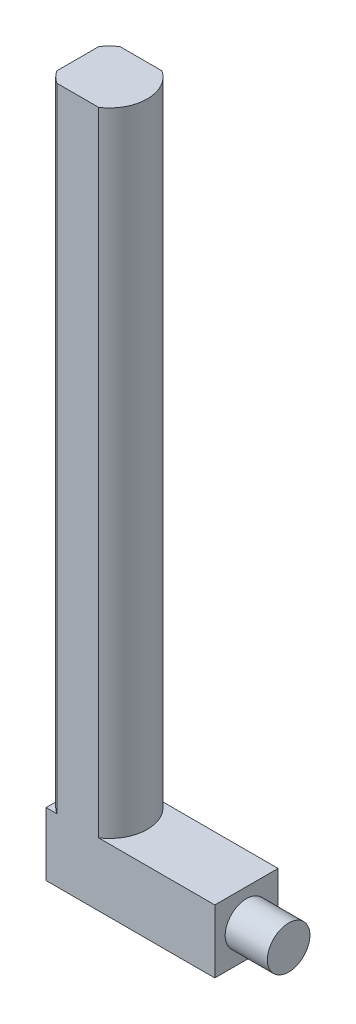
ISO-10303-21;
HEADER;
FILE_DESCRIPTION(('STEP AP214'),'2;1');
FILE_NAME('part.step','',(''),(''),'','','');
FILE_SCHEMA(('AUTOMOTIVE_DESIGN { 1 0 10303 214 1 1 1 1 }'));
ENDSEC;
DATA;
#1=APPLICATION_CONTEXT('core data for automotive mechanical design processes');
#2=APPLICATION_PROTOCOL_DEFINITION('international standard','automotive_design',2000,#1);
#3=PRODUCT_CONTEXT('',#1,'mechanical');
#4=PRODUCT('Part','Part','',(#3));
#5=PRODUCT_RELATED_PRODUCT_CATEGORY('part','',(#4));
#6=PRODUCT_DEFINITION_FORMATION('','',#4);
#7=PRODUCT_DEFINITION_CONTEXT('part definition',#1,'design');
#8=PRODUCT_DEFINITION('design','',#6,#7);
#9=PRODUCT_DEFINITION_SHAPE('','',#8);
#10=(LENGTH_UNIT() NAMED_UNIT(*) SI_UNIT(.MILLI.,.METRE.));
#11=(NAMED_UNIT(*) PLANE_ANGLE_UNIT() SI_UNIT($,.RADIAN.));
#12=(NAMED_UNIT(*) SI_UNIT($,.STERADIAN.) SOLID_ANGLE_UNIT());
#13=UNCERTAINTY_MEASURE_WITH_UNIT(LENGTH_MEASURE(1.E-05),#10,'distance_accuracy_value','');
#14=(GEOMETRIC_REPRESENTATION_CONTEXT(3) GLOBAL_UNCERTAINTY_ASSIGNED_CONTEXT((#13)) GLOBAL_UNIT_ASSIGNED_CONTEXT((#10,
#11,#12)) REPRESENTATION_CONTEXT('',''));
#15=CARTESIAN_POINT('',(0.,0.,0.));
#16=DIRECTION('',(0.,0.,1.));
#17=DIRECTION('',(1.,0.,0.));
#18=AXIS2_PLACEMENT_3D('',#15,#16,#17);
#19=CARTESIAN_POINT('',(-14.053094549401,-33.4957977879027,9.525));
#20=DIRECTION('',(0.,1.,0.));
#21=DIRECTION('',(0.,0.,1.));
#22=AXIS2_PLACEMENT_3D('',#19,#20,#21);
#23=PLANE('',#22);
#24=CARTESIAN_POINT('',(14.521905450599,-33.4957977879027,-19.05));
#25=DIRECTION('',(0.,1.,0.));
#26=DIRECTION('',(0.,0.,1.));
#27=AXIS2_PLACEMENT_3D('',#24,#25,#26);
#28=CIRCLE('',#27,34.283027690858);
#29=CARTESIAN_POINT('',(33.4637998292543,-33.4957977879027,9.525));
#30=VERTEX_POINT('',#29);
#31=CARTESIAN_POINT('',(33.4637998292543,-33.4957977879027,-47.625));
#32=VERTEX_POINT('',#31);
#33=EDGE_CURVE('E140',#30,#32,#28,.T.);
#34=ORIENTED_EDGE('',*,*,#33,.F.);
#35=DIRECTION('',(1.,0.,0.));
#36=VECTOR('',#35,1.);
#37=CARTESIAN_POINT('',(-14.053094549401,-33.4957977879027,9.525));
#38=LINE('',#37,#36);
#39=CARTESIAN_POINT('',(138.346905450599,-33.4957977879027,9.525));
#40=VERTEX_POINT('',#39);
#41=EDGE_CURVE('E152',#30,#40,#38,.T.);
#42=ORIENTED_EDGE('',*,*,#41,.T.);
#43=DIRECTION('',(0.,0.,-1.));
#44=VECTOR('',#43,1.);
#45=CARTESIAN_POINT('',(138.346905450599,-33.4957977879027,9.525));
#46=LINE('',#45,#44);
#47=CARTESIAN_POINT('',(138.346905450599,-33.4957977879027,-47.625));
#48=VERTEX_POINT('',#47);
#49=EDGE_CURVE('E156',#40,#48,#46,.T.);
#50=ORIENTED_EDGE('',*,*,#49,.T.);
#51=DIRECTION('',(-1.,0.,0.));
#52=VECTOR('',#51,1.);
#53=CARTESIAN_POINT('',(138.346905450599,-33.4957977879027,-47.625));
#54=LINE('',#53,#52);
#55=EDGE_CURVE('E64',#48,#32,#54,.T.);
#56=ORIENTED_EDGE('',*,*,#55,.T.);
#57=EDGE_LOOP('',(#34,#42,#50,#56));
#58=FACE_BOUND('',#57,.T.);
#59=ADVANCED_FACE('F40',(#58),#23,.T.);
#60=CARTESIAN_POINT('',(14.521905450599,-33.4957977879027,-19.05));
#61=DIRECTION('',(0.,1.,0.));
#62=DIRECTION('',(0.,0.,1.));
#63=AXIS2_PLACEMENT_3D('',#60,#61,#62);
#64=CIRCLE('',#63,34.283027690858);
#65=CARTESIAN_POINT('',(-14.053094549401,-33.4957977879027,-0.1081056213447));
#66=VERTEX_POINT('',#65);
#67=CARTESIAN_POINT('',(-4.41998892805627,-33.4957977879027,9.525));
#68=VERTEX_POINT('',#67);
#69=EDGE_CURVE('E137',#66,#68,#64,.T.);
#70=ORIENTED_EDGE('',*,*,#69,.F.);
#71=DIRECTION('',(0.,0.,1.));
#72=VECTOR('',#71,1.);
#73=CARTESIAN_POINT('',(-14.053094549401,-33.4957977879027,-47.625));
#74=LINE('',#73,#72);
#75=CARTESIAN_POINT('',(-14.053094549401,-33.4957977879027,9.525));
#76=VERTEX_POINT('',#75);
#77=EDGE_CURVE('E153',#66,#76,#74,.T.);
#78=ORIENTED_EDGE('',*,*,#77,.T.);
#79=EDGE_CURVE('E154',#76,#68,#38,.T.);
#80=ORIENTED_EDGE('',*,*,#79,.T.);
#81=EDGE_LOOP('',(#70,#78,#80));
#82=FACE_BOUND('',#81,.T.);
#83=ADVANCED_FACE('F221',(#82),#23,.T.);
#84=CARTESIAN_POINT('',(-14.053094549401,-33.4957977879027,-47.625));
#85=DIRECTION('',(1.,0.,0.));
#86=DIRECTION('',(0.,0.,-1.));
#87=AXIS2_PLACEMENT_3D('',#84,#85,#86);
#88=PLANE('',#87);
#89=DIRECTION('',(0.,0.,1.));
#90=VECTOR('',#89,1.);
#91=CARTESIAN_POINT('',(-14.053094549401,-90.6457977879027,-47.625));
#92=LINE('',#91,#90);
#93=CARTESIAN_POINT('',(-14.053094549401,-90.6457977879027,-47.625));
#94=VERTEX_POINT('',#93);
#95=CARTESIAN_POINT('',(-14.053094549401,-90.6457977879027,9.525));
#96=VERTEX_POINT('',#95);
#97=EDGE_CURVE('E144',#94,#96,#92,.T.);
#98=ORIENTED_EDGE('',*,*,#97,.T.);
#99=DIRECTION('',(0.,-1.,0.));
#100=VECTOR('',#99,1.);
#101=CARTESIAN_POINT('',(-14.053094549401,-33.4957977879027,9.525));
#102=LINE('',#101,#100);
#103=EDGE_CURVE('E44',#76,#96,#102,.T.);
#104=ORIENTED_EDGE('',*,*,#103,.F.);
#105=ORIENTED_EDGE('',*,*,#77,.F.);
#106=DIRECTION('',(0.,-1.,0.));
#107=VECTOR('',#106,1.);
#108=CARTESIAN_POINT('',(-14.053094549401,538.004202212097,-0.1081056213447));
#109=LINE('',#108,#107);
#110=CARTESIAN_POINT('',(-14.053094549401,538.004202212097,-0.1081056213447));
#111=VERTEX_POINT('',#110);
#112=EDGE_CURVE('E211',#111,#66,#109,.T.);
#113=ORIENTED_EDGE('',*,*,#112,.F.);
#114=DIRECTION('',(0.,0.,1.));
#115=VECTOR('',#114,1.);
#116=CARTESIAN_POINT('',(-14.053094549401,538.004202212097,9.525));
#117=LINE('',#116,#115);
#118=CARTESIAN_POINT('',(-14.053094549401,538.004202212097,-37.9918943786553));
#119=VERTEX_POINT('',#118);
#120=EDGE_CURVE('E219',#119,#111,#117,.T.);
#121=ORIENTED_EDGE('',*,*,#120,.F.);
#122=DIRECTION('',(0.,-1.,0.));
#123=VECTOR('',#122,1.);
#124=CARTESIAN_POINT('',(-14.053094549401,538.004202212097,-37.9918943786553));
#125=LINE('',#124,#123);
#126=CARTESIAN_POINT('',(-14.053094549401,-33.4957977879027,-37.9918943786553));
#127=VERTEX_POINT('',#126);
#128=EDGE_CURVE('E146',#119,#127,#125,.T.);
#129=ORIENTED_EDGE('',*,*,#128,.T.);
#130=CARTESIAN_POINT('',(-14.053094549401,-33.4957977879027,-47.625));
#131=VERTEX_POINT('',#130);
#132=EDGE_CURVE('E150',#131,#127,#74,.T.);
#133=ORIENTED_EDGE('',*,*,#132,.F.);
#134=DIRECTION('',(0.,-1.,0.));
#135=VECTOR('',#134,1.);
#136=CARTESIAN_POINT('',(-14.053094549401,-33.4957977879027,-47.625));
#137=LINE('',#136,#135);
#138=EDGE_CURVE('E160',#131,#94,#137,.T.);
#139=ORIENTED_EDGE('',*,*,#138,.T.);
#140=EDGE_LOOP('',(#98,#104,#105,#113,#121,#129,#133,#139));
#141=FACE_BOUND('',#140,.T.);
#142=ADVANCED_FACE('F42',(#141),#88,.F.);
#143=CARTESIAN_POINT('',(-14.053094549401,-33.4957977879027,9.525));
#144=DIRECTION('',(0.,0.,-1.));
#145=DIRECTION('',(-1.,0.,0.));
#146=AXIS2_PLACEMENT_3D('',#143,#144,#145);
#147=PLANE('',#146);
#148=DIRECTION('',(1.,0.,0.));
#149=VECTOR('',#148,1.);
#150=CARTESIAN_POINT('',(-14.053094549401,-90.6457977879027,9.525));
#151=LINE('',#150,#149);
#152=CARTESIAN_POINT('',(138.346905450599,-90.6457977879027,9.525));
#153=VERTEX_POINT('',#152);
#154=EDGE_CURVE('E163',#96,#153,#151,.T.);
#155=ORIENTED_EDGE('',*,*,#154,.T.);
#156=DIRECTION('',(0.,-1.,0.));
#157=VECTOR('',#156,1.);
#158=CARTESIAN_POINT('',(138.346905450599,-33.4957977879027,9.525));
#159=LINE('',#158,#157);
#160=EDGE_CURVE('E173',#40,#153,#159,.T.);
#161=ORIENTED_EDGE('',*,*,#160,.F.);
#162=ORIENTED_EDGE('',*,*,#41,.F.);
#163=DIRECTION('',(0.,-1.,0.));
#164=VECTOR('',#163,1.);
#165=CARTESIAN_POINT('',(33.4637998292543,538.004202212097,9.525));
#166=LINE('',#165,#164);
#167=CARTESIAN_POINT('',(33.4637998292543,538.004202212097,9.525));
#168=VERTEX_POINT('',#167);
#169=EDGE_CURVE('E207',#168,#30,#166,.T.);
#170=ORIENTED_EDGE('',*,*,#169,.F.);
#171=DIRECTION('',(1.,0.,0.));
#172=VECTOR('',#171,1.);
#173=CARTESIAN_POINT('',(-14.053094549401,538.004202212097,9.525));
#174=LINE('',#173,#172);
#175=CARTESIAN_POINT('',(-4.41998892805627,538.004202212097,9.525));
#176=VERTEX_POINT('',#175);
#177=EDGE_CURVE('E133',#176,#168,#174,.T.);
#178=ORIENTED_EDGE('',*,*,#177,.F.);
#179=DIRECTION('',(0.,-1.,0.));
#180=VECTOR('',#179,1.);
#181=CARTESIAN_POINT('',(-4.41998892805627,538.004202212097,9.525));
#182=LINE('',#181,#180);
#183=EDGE_CURVE('E209',#176,#68,#182,.T.);
#184=ORIENTED_EDGE('',*,*,#183,.T.);
#185=ORIENTED_EDGE('',*,*,#79,.F.);
#186=ORIENTED_EDGE('',*,*,#103,.T.);
#187=EDGE_LOOP('',(#155,#161,#162,#170,#178,#184,#185,#186));
#188=FACE_BOUND('',#187,.T.);
#189=ADVANCED_FACE('F183',(#188),#147,.F.);
#190=CARTESIAN_POINT('',(138.346905450599,-33.4957977879027,9.525));
#191=DIRECTION('',(-1.,0.,0.));
#192=DIRECTION('',(0.,0.,1.));
#193=AXIS2_PLACEMENT_3D('',#190,#191,#192);
#194=PLANE('',#193);
#195=CARTESIAN_POINT('',(138.346905450599,-62.0707977879027,-19.05));
#196=DIRECTION('',(1.,0.,0.));
#197=DIRECTION('',(0.,0.,-1.));
#198=AXIS2_PLACEMENT_3D('',#195,#196,#197);
#199=CIRCLE('',#198,19.216165489231);
#200=CARTESIAN_POINT('',(138.346905450599,-62.0707977879027,-38.266165489231));
#201=VERTEX_POINT('',#200);
#202=EDGE_CURVE('E11',#201,#201,#199,.T.);
#203=ORIENTED_EDGE('',*,*,#202,.F.);
#204=EDGE_LOOP('',(#203));
#205=FACE_BOUND('',#204,.T.);
#206=DIRECTION('',(0.,0.,-1.));
#207=VECTOR('',#206,1.);
#208=CARTESIAN_POINT('',(138.346905450599,-90.6457977879027,9.525));
#209=LINE('',#208,#207);
#210=CARTESIAN_POINT('',(138.346905450599,-90.6457977879027,-47.625));
#211=VERTEX_POINT('',#210);
#212=EDGE_CURVE('E165',#153,#211,#209,.T.);
#213=ORIENTED_EDGE('',*,*,#212,.T.);
#214=DIRECTION('',(0.,-1.,0.));
#215=VECTOR('',#214,1.);
#216=CARTESIAN_POINT('',(138.346905450599,-33.4957977879027,-47.625));
#217=LINE('',#216,#215);
#218=EDGE_CURVE('E171',#48,#211,#217,.T.);
#219=ORIENTED_EDGE('',*,*,#218,.F.);
#220=ORIENTED_EDGE('',*,*,#49,.F.);
#221=ORIENTED_EDGE('',*,*,#160,.T.);
#222=EDGE_LOOP('',(#213,#219,#220,#221));
#223=FACE_BOUND('',#222,.T.);
#224=ADVANCED_FACE('F194',(#205,#223),#194,.F.);
#225=CARTESIAN_POINT('',(138.346905450599,-33.4957977879027,-47.625));
#226=DIRECTION('',(0.,0.,1.));
#227=DIRECTION('',(1.,0.,0.));
#228=AXIS2_PLACEMENT_3D('',#225,#226,#227);
#229=PLANE('',#228);
#230=DIRECTION('',(-1.,0.,0.));
#231=VECTOR('',#230,1.);
#232=CARTESIAN_POINT('',(138.346905450599,-90.6457977879027,-47.625));
#233=LINE('',#232,#231);
#234=EDGE_CURVE('E167',#211,#94,#233,.T.);
#235=ORIENTED_EDGE('',*,*,#234,.T.);
#236=ORIENTED_EDGE('',*,*,#138,.F.);
#237=CARTESIAN_POINT('',(-4.41998892805627,-33.4957977879027,-47.625));
#238=VERTEX_POINT('',#237);
#239=EDGE_CURVE('E158',#238,#131,#54,.T.);
#240=ORIENTED_EDGE('',*,*,#239,.F.);
#241=DIRECTION('',(0.,-1.,0.));
#242=VECTOR('',#241,1.);
#243=CARTESIAN_POINT('',(-4.41998892805627,538.004202212097,-47.625));
#244=LINE('',#243,#242);
#245=CARTESIAN_POINT('',(-4.41998892805627,538.004202212097,-47.625));
#246=VERTEX_POINT('',#245);
#247=EDGE_CURVE('E124',#246,#238,#244,.T.);
#248=ORIENTED_EDGE('',*,*,#247,.F.);
#249=DIRECTION('',(-1.,0.,0.));
#250=VECTOR('',#249,1.);
#251=CARTESIAN_POINT('',(-14.053094549401,538.004202212097,-47.625));
#252=LINE('',#251,#250);
#253=CARTESIAN_POINT('',(33.4637998292543,538.004202212097,-47.625));
#254=VERTEX_POINT('',#253);
#255=EDGE_CURVE('E117',#254,#246,#252,.T.);
#256=ORIENTED_EDGE('',*,*,#255,.F.);
#257=DIRECTION('',(0.,-1.,0.));
#258=VECTOR('',#257,1.);
#259=CARTESIAN_POINT('',(33.4637998292543,538.004202212097,-47.625));
#260=LINE('',#259,#258);
#261=EDGE_CURVE('E121',#254,#32,#260,.T.);
#262=ORIENTED_EDGE('',*,*,#261,.T.);
#263=ORIENTED_EDGE('',*,*,#55,.F.);
#264=ORIENTED_EDGE('',*,*,#218,.T.);
#265=EDGE_LOOP('',(#235,#236,#240,#248,#256,#262,#263,#264));
#266=FACE_BOUND('',#265,.T.);
#267=ADVANCED_FACE('F119',(#266),#229,.F.);
#268=CARTESIAN_POINT('',(14.521905450599,-33.4957977879027,-19.05));
#269=DIRECTION('',(0.,1.,0.));
#270=DIRECTION('',(0.,0.,1.));
#271=AXIS2_PLACEMENT_3D('',#268,#269,#270);
#272=CIRCLE('',#271,34.283027690858);
#273=EDGE_CURVE('E56',#238,#127,#272,.T.);
#274=ORIENTED_EDGE('',*,*,#273,.F.);
#275=ORIENTED_EDGE('',*,*,#239,.T.);
#276=ORIENTED_EDGE('',*,*,#132,.T.);
#277=EDGE_LOOP('',(#274,#275,#276));
#278=FACE_BOUND('',#277,.T.);
#279=ADVANCED_FACE('F198',(#278),#23,.T.);
#280=CARTESIAN_POINT('',(-14.053094549401,-90.6457977879027,9.525));
#281=DIRECTION('',(0.,1.,0.));
#282=DIRECTION('',(0.,0.,1.));
#283=AXIS2_PLACEMENT_3D('',#280,#281,#282);
#284=PLANE('',#283);
#285=ORIENTED_EDGE('',*,*,#97,.F.);
#286=ORIENTED_EDGE('',*,*,#234,.F.);
#287=ORIENTED_EDGE('',*,*,#212,.F.);
#288=ORIENTED_EDGE('',*,*,#154,.F.);
#289=EDGE_LOOP('',(#285,#286,#287,#288));
#290=FACE_BOUND('',#289,.T.);
#291=ADVANCED_FACE('F192',(#290),#284,.F.);
#292=CARTESIAN_POINT('',(176.446905450599,-62.0707977879027,-19.05));
#293=DIRECTION('',(-1.,0.,0.));
#294=DIRECTION('',(0.,0.,1.));
#295=AXIS2_PLACEMENT_3D('',#292,#293,#294);
#296=CYLINDRICAL_SURFACE('',#295,19.216165489231);
#297=CARTESIAN_POINT('',(176.446905450599,-62.0707977879027,-19.05));
#298=DIRECTION('',(1.,0.,0.));
#299=DIRECTION('',(0.,0.,-1.));
#300=AXIS2_PLACEMENT_3D('',#297,#298,#299);
#301=CIRCLE('',#300,19.216165489231);
#302=CARTESIAN_POINT('',(176.446905450599,-62.0707977879027,-38.266165489231));
#303=VERTEX_POINT('',#302);
#304=EDGE_CURVE('E141',#303,#303,#301,.T.);
#305=ORIENTED_EDGE('',*,*,#304,.F.);
#306=EDGE_LOOP('',(#305));
#307=FACE_BOUND('',#306,.T.);
#308=ORIENTED_EDGE('',*,*,#202,.T.);
#309=EDGE_LOOP('',(#308));
#310=FACE_BOUND('',#309,.T.);
#311=ADVANCED_FACE('F235',(#307,#310),#296,.T.);
#312=CARTESIAN_POINT('',(176.446905450599,-90.6457977879027,9.525));
#313=DIRECTION('',(1.,0.,0.));
#314=DIRECTION('',(0.,0.,-1.));
#315=AXIS2_PLACEMENT_3D('',#312,#313,#314);
#316=PLANE('',#315);
#317=ORIENTED_EDGE('',*,*,#304,.T.);
#318=EDGE_LOOP('',(#317));
#319=FACE_BOUND('',#318,.T.);
#320=ADVANCED_FACE('F280',(#319),#316,.T.);
#321=CARTESIAN_POINT('',(14.521905450599,538.004202212097,-19.05));
#322=DIRECTION('',(0.,-1.,0.));
#323=DIRECTION('',(0.,0.,-1.));
#324=AXIS2_PLACEMENT_3D('',#321,#322,#323);
#325=CYLINDRICAL_SURFACE('',#324,34.283027690858);
#326=ORIENTED_EDGE('',*,*,#33,.T.);
#327=ORIENTED_EDGE('',*,*,#261,.F.);
#328=CARTESIAN_POINT('',(14.521905450599,538.004202212097,-19.05));
#329=DIRECTION('',(0.,1.,0.));
#330=DIRECTION('',(0.,0.,1.));
#331=AXIS2_PLACEMENT_3D('',#328,#329,#330);
#332=CIRCLE('',#331,34.283027690858);
#333=EDGE_CURVE('E128',#168,#254,#332,.T.);
#334=ORIENTED_EDGE('',*,*,#333,.F.);
#335=ORIENTED_EDGE('',*,*,#169,.T.);
#336=EDGE_LOOP('',(#326,#327,#334,#335));
#337=FACE_BOUND('',#336,.T.);
#338=ADVANCED_FACE('F139',(#337),#325,.T.);
#339=CARTESIAN_POINT('',(14.521905450599,538.004202212097,-19.05));
#340=DIRECTION('',(0.,-1.,0.));
#341=DIRECTION('',(0.,0.,-1.));
#342=AXIS2_PLACEMENT_3D('',#339,#340,#341);
#343=CYLINDRICAL_SURFACE('',#342,34.283027690858);
#344=ORIENTED_EDGE('',*,*,#273,.T.);
#345=ORIENTED_EDGE('',*,*,#128,.F.);
#346=CARTESIAN_POINT('',(14.521905450599,538.004202212097,-19.05));
#347=DIRECTION('',(0.,1.,0.));
#348=DIRECTION('',(0.,0.,1.));
#349=AXIS2_PLACEMENT_3D('',#346,#347,#348);
#350=CIRCLE('',#349,34.283027690858);
#351=EDGE_CURVE('E127',#246,#119,#350,.T.);
#352=ORIENTED_EDGE('',*,*,#351,.F.);
#353=ORIENTED_EDGE('',*,*,#247,.T.);
#354=EDGE_LOOP('',(#344,#345,#352,#353));
#355=FACE_BOUND('',#354,.T.);
#356=ADVANCED_FACE('F200',(#355),#343,.T.);
#357=CARTESIAN_POINT('',(14.521905450599,538.004202212097,-19.05));
#358=DIRECTION('',(0.,-1.,0.));
#359=DIRECTION('',(0.,0.,-1.));
#360=AXIS2_PLACEMENT_3D('',#357,#358,#359);
#361=CYLINDRICAL_SURFACE('',#360,34.283027690858);
#362=ORIENTED_EDGE('',*,*,#69,.T.);
#363=ORIENTED_EDGE('',*,*,#183,.F.);
#364=CARTESIAN_POINT('',(14.521905450599,538.004202212097,-19.05));
#365=DIRECTION('',(0.,1.,0.));
#366=DIRECTION('',(0.,0.,1.));
#367=AXIS2_PLACEMENT_3D('',#364,#365,#366);
#368=CIRCLE('',#367,34.283027690858);
#369=EDGE_CURVE('E218',#111,#176,#368,.T.);
#370=ORIENTED_EDGE('',*,*,#369,.F.);
#371=ORIENTED_EDGE('',*,*,#112,.T.);
#372=EDGE_LOOP('',(#362,#363,#370,#371));
#373=FACE_BOUND('',#372,.T.);
#374=ADVANCED_FACE('F216',(#373),#361,.T.);
#375=CARTESIAN_POINT('',(-14.053094549401,538.004202212097,9.525));
#376=DIRECTION('',(0.,1.,0.));
#377=DIRECTION('',(0.,0.,1.));
#378=AXIS2_PLACEMENT_3D('',#375,#376,#377);
#379=PLANE('',#378);
#380=ORIENTED_EDGE('',*,*,#333,.T.);
#381=ORIENTED_EDGE('',*,*,#255,.T.);
#382=ORIENTED_EDGE('',*,*,#351,.T.);
#383=ORIENTED_EDGE('',*,*,#120,.T.);
#384=ORIENTED_EDGE('',*,*,#369,.T.);
#385=ORIENTED_EDGE('',*,*,#177,.T.);
#386=EDGE_LOOP('',(#380,#381,#382,#383,#384,#385));
#387=FACE_BOUND('',#386,.T.);
#388=ADVANCED_FACE('F131',(#387),#379,.T.);
#389=CLOSED_SHELL('',(#59,#83,#142,#189,#224,#267,#279,#291,#311,#320,#338,#356,#374,#388));
#390=MANIFOLD_SOLID_BREP('B2',#389);
#391=ADVANCED_BREP_SHAPE_REPRESENTATION('',(#18,#390),#14);
#392=SHAPE_DEFINITION_REPRESENTATION(#9,#391);
ENDSEC;
END-ISO-10303-21;
